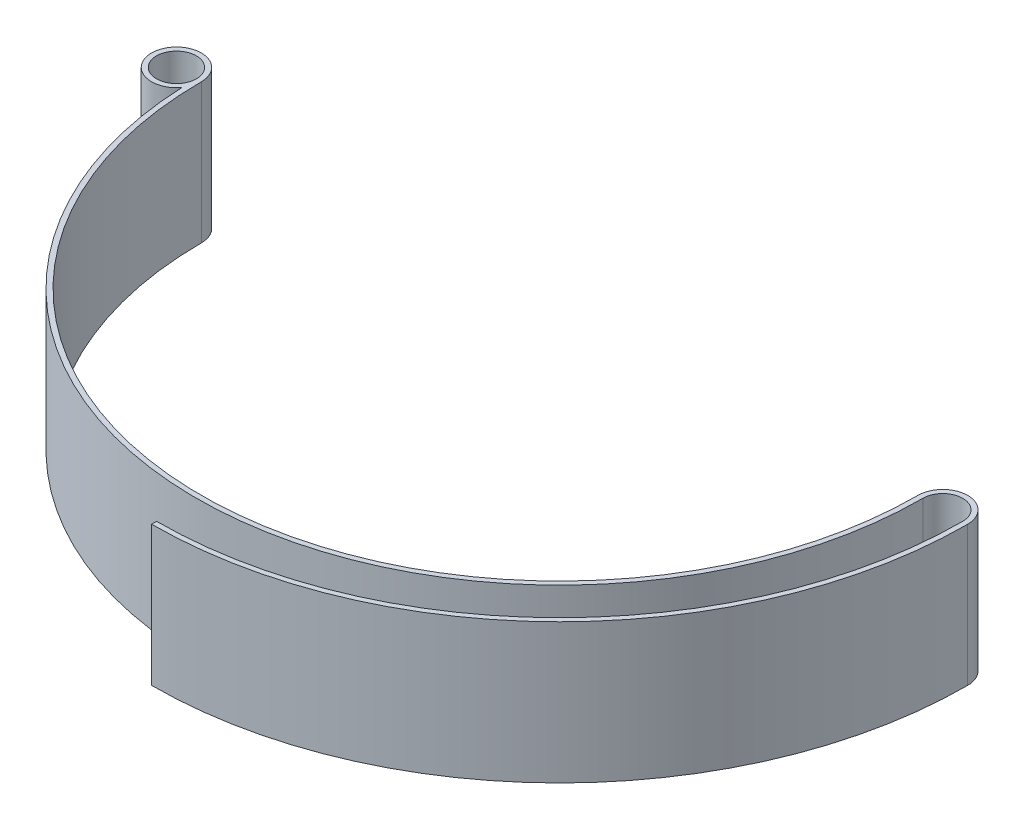
ISO-10303-21;
HEADER;
FILE_DESCRIPTION(('STEP AP214'),'2;1');
FILE_NAME('part.step','',(''),(''),'','','');
FILE_SCHEMA(('AUTOMOTIVE_DESIGN { 1 0 10303 214 1 1 1 1 }'));
ENDSEC;
DATA;
#1=APPLICATION_CONTEXT('core data for automotive mechanical design processes');
#2=APPLICATION_PROTOCOL_DEFINITION('international standard','automotive_design',2000,#1);
#3=PRODUCT_CONTEXT('',#1,'mechanical');
#4=PRODUCT('Part','Part','',(#3));
#5=PRODUCT_RELATED_PRODUCT_CATEGORY('part','',(#4));
#6=PRODUCT_DEFINITION_FORMATION('','',#4);
#7=PRODUCT_DEFINITION_CONTEXT('part definition',#1,'design');
#8=PRODUCT_DEFINITION('design','',#6,#7);
#9=PRODUCT_DEFINITION_SHAPE('','',#8);
#10=(LENGTH_UNIT() NAMED_UNIT(*) SI_UNIT(.MILLI.,.METRE.));
#11=(NAMED_UNIT(*) PLANE_ANGLE_UNIT() SI_UNIT($,.RADIAN.));
#12=(NAMED_UNIT(*) SI_UNIT($,.STERADIAN.) SOLID_ANGLE_UNIT());
#13=UNCERTAINTY_MEASURE_WITH_UNIT(LENGTH_MEASURE(1.E-05),#10,'distance_accuracy_value','');
#14=(GEOMETRIC_REPRESENTATION_CONTEXT(3) GLOBAL_UNCERTAINTY_ASSIGNED_CONTEXT((#13)) GLOBAL_UNIT_ASSIGNED_CONTEXT((#10,
#11,#12)) REPRESENTATION_CONTEXT('',''));
#15=CARTESIAN_POINT('',(0.,0.,0.));
#16=DIRECTION('',(0.,0.,1.));
#17=DIRECTION('',(1.,0.,0.));
#18=AXIS2_PLACEMENT_3D('',#15,#16,#17);
#19=CARTESIAN_POINT('',(0.,28.,0.));
#20=DIRECTION('',(0.,1.,0.));
#21=DIRECTION('',(0.,0.,1.));
#22=AXIS2_PLACEMENT_3D('',#19,#20,#21);
#23=PLANE('',#22);
#24=CARTESIAN_POINT('',(0.,28.,0.));
#25=DIRECTION('',(0.,1.,0.));
#26=DIRECTION('',(0.,0.,1.));
#27=AXIS2_PLACEMENT_3D('',#24,#25,#26);
#28=CIRCLE('',#27,5.);
#29=CARTESIAN_POINT('',(5.,28.,0.));
#30=VERTEX_POINT('',#29);
#31=CARTESIAN_POINT('',(4.0585594378294,28.,2.92029027488806));
#32=VERTEX_POINT('',#31);
#33=EDGE_CURVE('E145',#30,#32,#28,.T.);
#34=ORIENTED_EDGE('',*,*,#33,.T.);
#35=CARTESIAN_POINT('',(76.845,28.,0.));
#36=DIRECTION('',(0.,1.,0.));
#37=DIRECTION('',(0.,0.,1.));
#38=AXIS2_PLACEMENT_3D('',#35,#36,#37);
#39=CIRCLE('',#38,72.845);
#40=CARTESIAN_POINT('',(149.69,28.,0.));
#41=VERTEX_POINT('',#40);
#42=EDGE_CURVE('E93',#32,#41,#39,.T.);
#43=ORIENTED_EDGE('',*,*,#42,.T.);
#44=CARTESIAN_POINT('',(153.69,28.,0.));
#45=DIRECTION('',(0.,-1.,0.));
#46=DIRECTION('',(0.,0.,-1.));
#47=AXIS2_PLACEMENT_3D('',#44,#45,#46);
#48=CIRCLE('',#47,4.);
#49=CARTESIAN_POINT('',(157.69,28.,0.));
#50=VERTEX_POINT('',#49);
#51=EDGE_CURVE('E160',#41,#50,#48,.T.);
#52=ORIENTED_EDGE('',*,*,#51,.T.);
#53=CARTESIAN_POINT('',(76.845,28.,0.));
#54=DIRECTION('',(0.,-1.,0.));
#55=DIRECTION('',(0.,0.,-1.));
#56=AXIS2_PLACEMENT_3D('',#53,#54,#55);
#57=CIRCLE('',#56,80.845);
#58=CARTESIAN_POINT('',(76.845,28.,80.845));
#59=VERTEX_POINT('',#58);
#60=EDGE_CURVE('E173',#50,#59,#57,.T.);
#61=ORIENTED_EDGE('',*,*,#60,.T.);
#62=DIRECTION('',(0.,0.,1.));
#63=VECTOR('',#62,1.);
#64=CARTESIAN_POINT('',(76.845,28.,80.845));
#65=LINE('',#64,#63);
#66=CARTESIAN_POINT('',(76.845,28.,81.845));
#67=VERTEX_POINT('',#66);
#68=EDGE_CURVE('E112',#59,#67,#65,.T.);
#69=ORIENTED_EDGE('',*,*,#68,.T.);
#70=CARTESIAN_POINT('',(76.845,28.,0.));
#71=DIRECTION('',(0.,1.,0.));
#72=DIRECTION('',(0.,0.,-1.));
#73=AXIS2_PLACEMENT_3D('',#70,#71,#72);
#74=CIRCLE('',#73,81.845);
#75=CARTESIAN_POINT('',(158.69,28.,0.));
#76=VERTEX_POINT('',#75);
#77=EDGE_CURVE('E106',#67,#76,#74,.T.);
#78=ORIENTED_EDGE('',*,*,#77,.T.);
#79=CARTESIAN_POINT('',(153.69,28.,0.));
#80=DIRECTION('',(0.,1.,0.));
#81=DIRECTION('',(0.,0.,-1.));
#82=AXIS2_PLACEMENT_3D('',#79,#80,#81);
#83=CIRCLE('',#82,5.);
#84=CARTESIAN_POINT('',(148.69,28.,0.));
#85=VERTEX_POINT('',#84);
#86=EDGE_CURVE('E110',#76,#85,#83,.T.);
#87=ORIENTED_EDGE('',*,*,#86,.T.);
#88=CARTESIAN_POINT('',(76.845,28.,0.));
#89=DIRECTION('',(0.,-1.,0.));
#90=DIRECTION('',(0.,0.,1.));
#91=AXIS2_PLACEMENT_3D('',#88,#89,#90);
#92=CIRCLE('',#91,71.845);
#93=EDGE_CURVE('E50',#85,#30,#92,.T.);
#94=ORIENTED_EDGE('',*,*,#93,.T.);
#95=EDGE_LOOP('',(#34,#43,#52,#61,#69,#78,#87,#94));
#96=FACE_BOUND('',#95,.T.);
#97=CARTESIAN_POINT('',(0.,28.,0.));
#98=DIRECTION('',(0.,1.,0.));
#99=DIRECTION('',(0.,0.,1.));
#100=AXIS2_PLACEMENT_3D('',#97,#98,#99);
#101=CIRCLE('',#100,4.);
#102=CARTESIAN_POINT('',(0.,28.,4.));
#103=VERTEX_POINT('',#102);
#104=EDGE_CURVE('E134',#103,#103,#101,.T.);
#105=ORIENTED_EDGE('',*,*,#104,.F.);
#106=EDGE_LOOP('',(#105));
#107=FACE_BOUND('',#106,.T.);
#108=ADVANCED_FACE('F33',(#96,#107),#23,.T.);
#109=CARTESIAN_POINT('',(0.,0.,0.));
#110=DIRECTION('',(0.,1.,0.));
#111=DIRECTION('',(0.,0.,1.));
#112=AXIS2_PLACEMENT_3D('',#109,#110,#111);
#113=PLANE('',#112);
#114=CARTESIAN_POINT('',(0.,0.,0.));
#115=DIRECTION('',(0.,1.,0.));
#116=DIRECTION('',(0.,0.,1.));
#117=AXIS2_PLACEMENT_3D('',#114,#115,#116);
#118=CIRCLE('',#117,5.);
#119=CARTESIAN_POINT('',(5.,0.,0.));
#120=VERTEX_POINT('',#119);
#121=CARTESIAN_POINT('',(4.0585594378294,0.,2.92029027488806));
#122=VERTEX_POINT('',#121);
#123=EDGE_CURVE('E130',#120,#122,#118,.T.);
#124=ORIENTED_EDGE('',*,*,#123,.F.);
#125=CARTESIAN_POINT('',(76.845,0.,0.));
#126=DIRECTION('',(0.,-1.,0.));
#127=DIRECTION('',(0.,0.,1.));
#128=AXIS2_PLACEMENT_3D('',#125,#126,#127);
#129=CIRCLE('',#128,71.845);
#130=CARTESIAN_POINT('',(148.69,0.,0.));
#131=VERTEX_POINT('',#130);
#132=EDGE_CURVE('E85',#131,#120,#129,.T.);
#133=ORIENTED_EDGE('',*,*,#132,.F.);
#134=CARTESIAN_POINT('',(153.69,0.,0.));
#135=DIRECTION('',(0.,1.,0.));
#136=DIRECTION('',(0.,0.,-1.));
#137=AXIS2_PLACEMENT_3D('',#134,#135,#136);
#138=CIRCLE('',#137,5.);
#139=CARTESIAN_POINT('',(158.69,0.,0.));
#140=VERTEX_POINT('',#139);
#141=EDGE_CURVE('E79',#140,#131,#138,.T.);
#142=ORIENTED_EDGE('',*,*,#141,.F.);
#143=CARTESIAN_POINT('',(76.845,0.,0.));
#144=DIRECTION('',(0.,1.,0.));
#145=DIRECTION('',(0.,0.,-1.));
#146=AXIS2_PLACEMENT_3D('',#143,#144,#145);
#147=CIRCLE('',#146,81.845);
#148=CARTESIAN_POINT('',(76.845,0.,81.845));
#149=VERTEX_POINT('',#148);
#150=EDGE_CURVE('E120',#149,#140,#147,.T.);
#151=ORIENTED_EDGE('',*,*,#150,.F.);
#152=DIRECTION('',(0.,0.,1.));
#153=VECTOR('',#152,1.);
#154=CARTESIAN_POINT('',(76.845,0.,80.845));
#155=LINE('',#154,#153);
#156=CARTESIAN_POINT('',(76.845,0.,80.845));
#157=VERTEX_POINT('',#156);
#158=EDGE_CURVE('E140',#157,#149,#155,.T.);
#159=ORIENTED_EDGE('',*,*,#158,.F.);
#160=CARTESIAN_POINT('',(76.845,0.,0.));
#161=DIRECTION('',(0.,-1.,0.));
#162=DIRECTION('',(0.,0.,-1.));
#163=AXIS2_PLACEMENT_3D('',#160,#161,#162);
#164=CIRCLE('',#163,80.845);
#165=CARTESIAN_POINT('',(157.69,0.,0.));
#166=VERTEX_POINT('',#165);
#167=EDGE_CURVE('E138',#166,#157,#164,.T.);
#168=ORIENTED_EDGE('',*,*,#167,.F.);
#169=CARTESIAN_POINT('',(153.69,0.,0.));
#170=DIRECTION('',(0.,-1.,0.));
#171=DIRECTION('',(0.,0.,-1.));
#172=AXIS2_PLACEMENT_3D('',#169,#170,#171);
#173=CIRCLE('',#172,4.);
#174=CARTESIAN_POINT('',(149.69,0.,0.));
#175=VERTEX_POINT('',#174);
#176=EDGE_CURVE('E136',#175,#166,#173,.T.);
#177=ORIENTED_EDGE('',*,*,#176,.F.);
#178=CARTESIAN_POINT('',(76.845,0.,0.));
#179=DIRECTION('',(0.,1.,0.));
#180=DIRECTION('',(0.,0.,1.));
#181=AXIS2_PLACEMENT_3D('',#178,#179,#180);
#182=CIRCLE('',#181,72.845);
#183=EDGE_CURVE('E133',#122,#175,#182,.T.);
#184=ORIENTED_EDGE('',*,*,#183,.F.);
#185=EDGE_LOOP('',(#124,#133,#142,#151,#159,#168,#177,#184));
#186=FACE_BOUND('',#185,.T.);
#187=CARTESIAN_POINT('',(0.,0.,0.));
#188=DIRECTION('',(0.,1.,0.));
#189=DIRECTION('',(0.,0.,1.));
#190=AXIS2_PLACEMENT_3D('',#187,#188,#189);
#191=CIRCLE('',#190,4.);
#192=CARTESIAN_POINT('',(0.,0.,4.));
#193=VERTEX_POINT('',#192);
#194=EDGE_CURVE('E179',#193,#193,#191,.T.);
#195=ORIENTED_EDGE('',*,*,#194,.T.);
#196=EDGE_LOOP('',(#195));
#197=FACE_BOUND('',#196,.T.);
#198=ADVANCED_FACE('F164',(#186,#197),#113,.F.);
#199=CARTESIAN_POINT('',(0.,28.,0.));
#200=DIRECTION('',(0.,-1.,0.));
#201=DIRECTION('',(0.,0.,-1.));
#202=AXIS2_PLACEMENT_3D('',#199,#200,#201);
#203=CYLINDRICAL_SURFACE('',#202,5.);
#204=ORIENTED_EDGE('',*,*,#123,.T.);
#205=DIRECTION('',(0.,-1.,0.));
#206=VECTOR('',#205,1.);
#207=CARTESIAN_POINT('',(4.0585594378294,28.,2.92029027488806));
#208=LINE('',#207,#206);
#209=EDGE_CURVE('E11',#32,#122,#208,.T.);
#210=ORIENTED_EDGE('',*,*,#209,.F.);
#211=ORIENTED_EDGE('',*,*,#33,.F.);
#212=DIRECTION('',(0.,-1.,0.));
#213=VECTOR('',#212,1.);
#214=CARTESIAN_POINT('',(5.,28.,0.));
#215=LINE('',#214,#213);
#216=EDGE_CURVE('E126',#30,#120,#215,.T.);
#217=ORIENTED_EDGE('',*,*,#216,.T.);
#218=EDGE_LOOP('',(#204,#210,#211,#217));
#219=FACE_BOUND('',#218,.T.);
#220=ADVANCED_FACE('F35',(#219),#203,.T.);
#221=CARTESIAN_POINT('',(76.845,28.,0.));
#222=DIRECTION('',(0.,-1.,0.));
#223=DIRECTION('',(0.,0.,-1.));
#224=AXIS2_PLACEMENT_3D('',#221,#222,#223);
#225=CYLINDRICAL_SURFACE('',#224,72.845);
#226=ORIENTED_EDGE('',*,*,#183,.T.);
#227=DIRECTION('',(0.,-1.,0.));
#228=VECTOR('',#227,1.);
#229=CARTESIAN_POINT('',(149.69,28.,0.));
#230=LINE('',#229,#228);
#231=EDGE_CURVE('E42',#41,#175,#230,.T.);
#232=ORIENTED_EDGE('',*,*,#231,.F.);
#233=ORIENTED_EDGE('',*,*,#42,.F.);
#234=ORIENTED_EDGE('',*,*,#209,.T.);
#235=EDGE_LOOP('',(#226,#232,#233,#234));
#236=FACE_BOUND('',#235,.T.);
#237=ADVANCED_FACE('F207',(#236),#225,.T.);
#238=CARTESIAN_POINT('',(153.69,28.,0.));
#239=DIRECTION('',(0.,-1.,0.));
#240=DIRECTION('',(0.,0.,-1.));
#241=AXIS2_PLACEMENT_3D('',#238,#239,#240);
#242=CYLINDRICAL_SURFACE('',#241,4.);
#243=ORIENTED_EDGE('',*,*,#176,.T.);
#244=DIRECTION('',(0.,-1.,0.));
#245=VECTOR('',#244,1.);
#246=CARTESIAN_POINT('',(157.69,28.,0.));
#247=LINE('',#246,#245);
#248=EDGE_CURVE('E152',#50,#166,#247,.T.);
#249=ORIENTED_EDGE('',*,*,#248,.F.);
#250=ORIENTED_EDGE('',*,*,#51,.F.);
#251=ORIENTED_EDGE('',*,*,#231,.T.);
#252=EDGE_LOOP('',(#243,#249,#250,#251));
#253=FACE_BOUND('',#252,.T.);
#254=ADVANCED_FACE('F158',(#253),#242,.F.);
#255=CARTESIAN_POINT('',(76.845,28.,0.));
#256=DIRECTION('',(0.,-1.,0.));
#257=DIRECTION('',(0.,0.,-1.));
#258=AXIS2_PLACEMENT_3D('',#255,#256,#257);
#259=CYLINDRICAL_SURFACE('',#258,80.845);
#260=ORIENTED_EDGE('',*,*,#167,.T.);
#261=DIRECTION('',(0.,-1.,0.));
#262=VECTOR('',#261,1.);
#263=CARTESIAN_POINT('',(76.845,28.,80.845));
#264=LINE('',#263,#262);
#265=EDGE_CURVE('E149',#59,#157,#264,.T.);
#266=ORIENTED_EDGE('',*,*,#265,.F.);
#267=ORIENTED_EDGE('',*,*,#60,.F.);
#268=ORIENTED_EDGE('',*,*,#248,.T.);
#269=EDGE_LOOP('',(#260,#266,#267,#268));
#270=FACE_BOUND('',#269,.T.);
#271=ADVANCED_FACE('F169',(#270),#259,.F.);
#272=CARTESIAN_POINT('',(76.845,28.,80.845));
#273=DIRECTION('',(1.,0.,0.));
#274=DIRECTION('',(0.,0.,-1.));
#275=AXIS2_PLACEMENT_3D('',#272,#273,#274);
#276=PLANE('',#275);
#277=ORIENTED_EDGE('',*,*,#158,.T.);
#278=DIRECTION('',(0.,-1.,0.));
#279=VECTOR('',#278,1.);
#280=CARTESIAN_POINT('',(76.845,28.,81.845));
#281=LINE('',#280,#279);
#282=EDGE_CURVE('E121',#67,#149,#281,.T.);
#283=ORIENTED_EDGE('',*,*,#282,.F.);
#284=ORIENTED_EDGE('',*,*,#68,.F.);
#285=ORIENTED_EDGE('',*,*,#265,.T.);
#286=EDGE_LOOP('',(#277,#283,#284,#285));
#287=FACE_BOUND('',#286,.T.);
#288=ADVANCED_FACE('F172',(#287),#276,.F.);
#289=CARTESIAN_POINT('',(76.845,28.,0.));
#290=DIRECTION('',(0.,-1.,0.));
#291=DIRECTION('',(0.,0.,-1.));
#292=AXIS2_PLACEMENT_3D('',#289,#290,#291);
#293=CYLINDRICAL_SURFACE('',#292,81.845);
#294=ORIENTED_EDGE('',*,*,#150,.T.);
#295=DIRECTION('',(0.,-1.,0.));
#296=VECTOR('',#295,1.);
#297=CARTESIAN_POINT('',(158.69,28.,0.));
#298=LINE('',#297,#296);
#299=EDGE_CURVE('E117',#76,#140,#298,.T.);
#300=ORIENTED_EDGE('',*,*,#299,.F.);
#301=ORIENTED_EDGE('',*,*,#77,.F.);
#302=ORIENTED_EDGE('',*,*,#282,.T.);
#303=EDGE_LOOP('',(#294,#300,#301,#302));
#304=FACE_BOUND('',#303,.T.);
#305=ADVANCED_FACE('F118',(#304),#293,.T.);
#306=CARTESIAN_POINT('',(153.69,28.,0.));
#307=DIRECTION('',(0.,-1.,0.));
#308=DIRECTION('',(0.,0.,-1.));
#309=AXIS2_PLACEMENT_3D('',#306,#307,#308);
#310=CYLINDRICAL_SURFACE('',#309,5.);
#311=ORIENTED_EDGE('',*,*,#141,.T.);
#312=DIRECTION('',(0.,-1.,0.));
#313=VECTOR('',#312,1.);
#314=CARTESIAN_POINT('',(148.69,28.,0.));
#315=LINE('',#314,#313);
#316=EDGE_CURVE('E122',#85,#131,#315,.T.);
#317=ORIENTED_EDGE('',*,*,#316,.F.);
#318=ORIENTED_EDGE('',*,*,#86,.F.);
#319=ORIENTED_EDGE('',*,*,#299,.T.);
#320=EDGE_LOOP('',(#311,#317,#318,#319));
#321=FACE_BOUND('',#320,.T.);
#322=ADVANCED_FACE('F124',(#321),#310,.T.);
#323=CARTESIAN_POINT('',(76.845,28.,0.));
#324=DIRECTION('',(0.,-1.,0.));
#325=DIRECTION('',(0.,0.,-1.));
#326=AXIS2_PLACEMENT_3D('',#323,#324,#325);
#327=CYLINDRICAL_SURFACE('',#326,71.845);
#328=ORIENTED_EDGE('',*,*,#132,.T.);
#329=ORIENTED_EDGE('',*,*,#216,.F.);
#330=ORIENTED_EDGE('',*,*,#93,.F.);
#331=ORIENTED_EDGE('',*,*,#316,.T.);
#332=EDGE_LOOP('',(#328,#329,#330,#331));
#333=FACE_BOUND('',#332,.T.);
#334=ADVANCED_FACE('F195',(#333),#327,.F.);
#335=CARTESIAN_POINT('',(0.,28.,0.));
#336=DIRECTION('',(0.,-1.,0.));
#337=DIRECTION('',(0.,0.,-1.));
#338=AXIS2_PLACEMENT_3D('',#335,#336,#337);
#339=CYLINDRICAL_SURFACE('',#338,4.);
#340=ORIENTED_EDGE('',*,*,#104,.T.);
#341=EDGE_LOOP('',(#340));
#342=FACE_BOUND('',#341,.T.);
#343=ORIENTED_EDGE('',*,*,#194,.F.);
#344=EDGE_LOOP('',(#343));
#345=FACE_BOUND('',#344,.T.);
#346=ADVANCED_FACE('F185',(#342,#345),#339,.F.);
#347=CLOSED_SHELL('',(#108,#198,#220,#237,#254,#271,#288,#305,#322,#334,#346));
#348=MANIFOLD_SOLID_BREP('B2',#347);
#349=ADVANCED_BREP_SHAPE_REPRESENTATION('',(#18,#348),#14);
#350=SHAPE_DEFINITION_REPRESENTATION(#9,#349);
ENDSEC;
END-ISO-10303-21;
